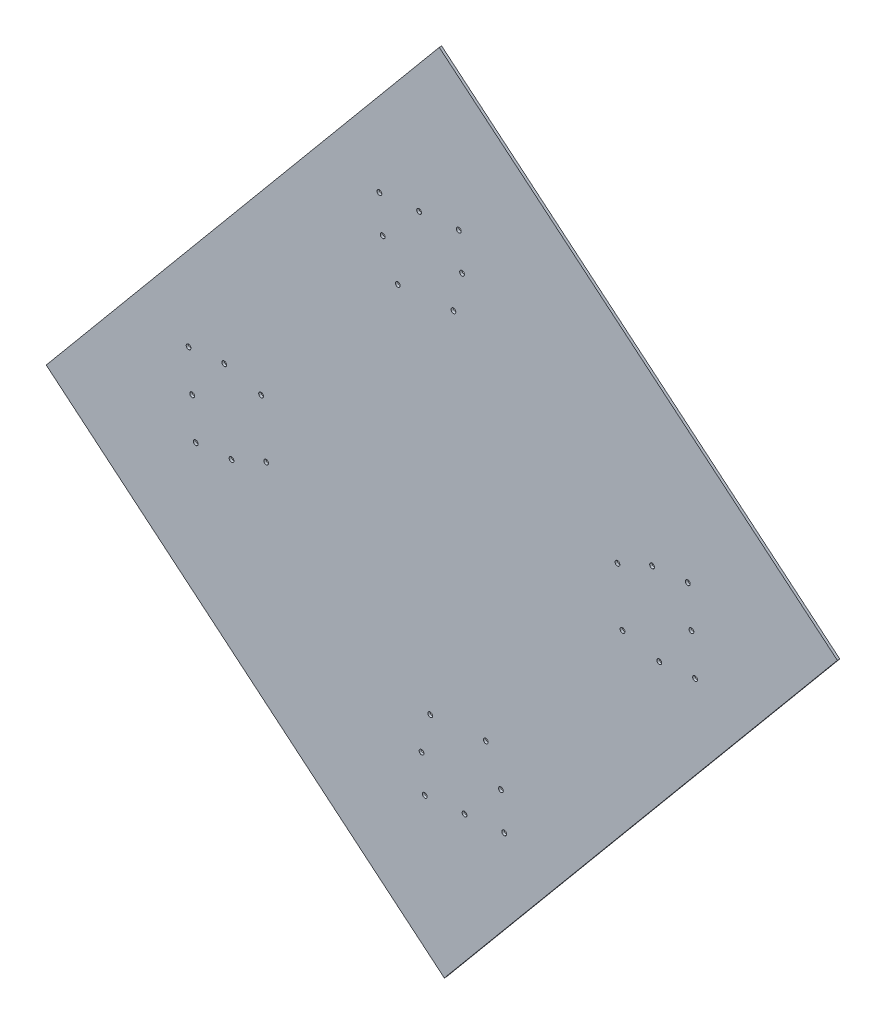
ISO-10303-21;
HEADER;
FILE_DESCRIPTION(('STEP AP214'),'2;1');
FILE_NAME('part.step','',(''),(''),'','','');
FILE_SCHEMA(('AUTOMOTIVE_DESIGN { 1 0 10303 214 1 1 1 1 }'));
ENDSEC;
DATA;
#1=APPLICATION_CONTEXT('core data for automotive mechanical design processes');
#2=APPLICATION_PROTOCOL_DEFINITION('international standard','automotive_design',2000,#1);
#3=PRODUCT_CONTEXT('',#1,'mechanical');
#4=PRODUCT('Part','Part','',(#3));
#5=PRODUCT_RELATED_PRODUCT_CATEGORY('part','',(#4));
#6=PRODUCT_DEFINITION_FORMATION('','',#4);
#7=PRODUCT_DEFINITION_CONTEXT('part definition',#1,'design');
#8=PRODUCT_DEFINITION('design','',#6,#7);
#9=PRODUCT_DEFINITION_SHAPE('','',#8);
#10=(LENGTH_UNIT() NAMED_UNIT(*) SI_UNIT(.MILLI.,.METRE.));
#11=(NAMED_UNIT(*) PLANE_ANGLE_UNIT() SI_UNIT($,.RADIAN.));
#12=(NAMED_UNIT(*) SI_UNIT($,.STERADIAN.) SOLID_ANGLE_UNIT());
#13=UNCERTAINTY_MEASURE_WITH_UNIT(LENGTH_MEASURE(1.E-05),#10,'distance_accuracy_value','');
#14=(GEOMETRIC_REPRESENTATION_CONTEXT(3) GLOBAL_UNCERTAINTY_ASSIGNED_CONTEXT((#13)) GLOBAL_UNIT_ASSIGNED_CONTEXT((#10,
#11,#12)) REPRESENTATION_CONTEXT('',''));
#15=CARTESIAN_POINT('',(0.,0.,0.));
#16=DIRECTION('',(0.,0.,1.));
#17=DIRECTION('',(1.,0.,0.));
#18=AXIS2_PLACEMENT_3D('',#15,#16,#17);
#19=CARTESIAN_POINT('',(0.,0.,3.));
#20=DIRECTION('',(0.,0.,1.));
#21=DIRECTION('',(1.,0.,0.));
#22=AXIS2_PLACEMENT_3D('',#19,#20,#21);
#23=PLANE('',#22);
#24=CARTESIAN_POINT('',(1000.31822953271,-1996.08546899373,3.));
#25=DIRECTION('',(0.,0.,1.));
#26=DIRECTION('',(1.,0.,0.));
#27=AXIS2_PLACEMENT_3D('',#24,#25,#26);
#28=CIRCLE('',#27,3.00000000000015);
#29=CARTESIAN_POINT('',(1003.31822953271,-1996.08546899373,3.));
#30=VERTEX_POINT('',#29);
#31=EDGE_CURVE('E265',#30,#30,#28,.T.);
#32=ORIENTED_EDGE('',*,*,#31,.F.);
#33=EDGE_LOOP('',(#32));
#34=FACE_BOUND('',#33,.T.);
#35=CARTESIAN_POINT('',(993.526055939657,-2087.07374504006,3.));
#36=DIRECTION('',(0.,0.,1.));
#37=DIRECTION('',(1.,0.,0.));
#38=AXIS2_PLACEMENT_3D('',#35,#36,#37);
#39=CIRCLE('',#38,2.99999999999988);
#40=CARTESIAN_POINT('',(996.526055939657,-2087.07374504006,3.));
#41=VERTEX_POINT('',#40);
#42=EDGE_CURVE('E253',#41,#41,#39,.T.);
#43=ORIENTED_EDGE('',*,*,#42,.F.);
#44=EDGE_LOOP('',(#43));
#45=FACE_BOUND('',#44,.T.);
#46=CARTESIAN_POINT('',(1093.11557483534,-2078.02235143862,3.));
#47=DIRECTION('',(0.,0.,1.));
#48=DIRECTION('',(1.,0.,0.));
#49=AXIS2_PLACEMENT_3D('',#46,#47,#48);
#50=CIRCLE('',#49,3.00000000000043);
#51=CARTESIAN_POINT('',(1096.11557483534,-2078.02235143862,3.));
#52=VERTEX_POINT('',#51);
#53=EDGE_CURVE('E241',#52,#52,#50,.T.);
#54=ORIENTED_EDGE('',*,*,#53,.F.);
#55=EDGE_LOOP('',(#54));
#56=FACE_BOUND('',#55,.T.);
#57=CARTESIAN_POINT('',(959.695575049455,-1549.12770818995,3.));
#58=DIRECTION('',(0.,0.,1.));
#59=DIRECTION('',(1.,0.,0.));
#60=AXIS2_PLACEMENT_3D('',#57,#58,#59);
#61=CIRCLE('',#60,3.00000000000015);
#62=CARTESIAN_POINT('',(962.695575049456,-1549.12770818995,3.));
#63=VERTEX_POINT('',#62);
#64=EDGE_CURVE('E229',#63,#63,#61,.T.);
#65=ORIENTED_EDGE('',*,*,#64,.F.);
#66=EDGE_LOOP('',(#65));
#67=FACE_BOUND('',#66,.T.);
#68=CARTESIAN_POINT('',(1040.27353899013,-1496.61874012567,3.));
#69=DIRECTION('',(0.,0.,1.));
#70=DIRECTION('',(1.,0.,0.));
#71=AXIS2_PLACEMENT_3D('',#68,#69,#70);
#72=CIRCLE('',#71,3.00000000000015);
#73=CARTESIAN_POINT('',(1043.27353899013,-1496.61874012567,3.));
#74=VERTEX_POINT('',#73);
#75=EDGE_CURVE('E217',#74,#74,#72,.T.);
#76=ORIENTED_EDGE('',*,*,#75,.F.);
#77=EDGE_LOOP('',(#76));
#78=FACE_BOUND('',#77,.T.);
#79=CARTESIAN_POINT('',(986.405652421644,-1456.32915342334,3.));
#80=DIRECTION('',(0.,0.,1.));
#81=DIRECTION('',(1.,0.,0.));
#82=AXIS2_PLACEMENT_3D('',#79,#80,#81);
#83=CIRCLE('',#82,3.00000000000015);
#84=CARTESIAN_POINT('',(989.405652421645,-1456.32915342334,3.));
#85=VERTEX_POINT('',#84);
#86=EDGE_CURVE('E205',#85,#85,#83,.T.);
#87=ORIENTED_EDGE('',*,*,#86,.F.);
#88=EDGE_LOOP('',(#87));
#89=FACE_BOUND('',#88,.T.);
#90=CARTESIAN_POINT('',(940.684020094458,-1505.67013372711,3.));
#91=DIRECTION('',(0.,0.,1.));
#92=DIRECTION('',(1.,0.,0.));
#93=AXIS2_PLACEMENT_3D('',#90,#91,#92);
#94=CIRCLE('',#93,2.99999999999994);
#95=CARTESIAN_POINT('',(943.684020094458,-1505.67013372711,3.));
#96=VERTEX_POINT('',#95);
#97=EDGE_CURVE('E193',#96,#96,#94,.T.);
#98=ORIENTED_EDGE('',*,*,#97,.F.);
#99=EDGE_LOOP('',(#98));
#100=FACE_BOUND('',#99,.T.);
#101=CARTESIAN_POINT('',(1332.49837811329,-1790.77577879625,3.));
#102=DIRECTION('',(0.,0.,1.));
#103=DIRECTION('',(1.,0.,0.));
#104=AXIS2_PLACEMENT_3D('',#101,#102,#103);
#105=CIRCLE('',#104,3.00000000000015);
#106=CARTESIAN_POINT('',(1335.49837811329,-1790.77577879625,3.));
#107=VERTEX_POINT('',#106);
#108=EDGE_CURVE('E181',#107,#107,#105,.T.);
#109=ORIENTED_EDGE('',*,*,#108,.F.);
#110=EDGE_LOOP('',(#109));
#111=FACE_BOUND('',#110,.T.);
#112=CARTESIAN_POINT('',(706.279483297293,-1847.69094176211,3.));
#113=DIRECTION('',(0.,0.,1.));
#114=DIRECTION('',(1.,0.,0.));
#115=AXIS2_PLACEMENT_3D('',#112,#113,#114);
#116=CIRCLE('',#115,3.00000000000005);
#117=CARTESIAN_POINT('',(709.279483297293,-1847.69094176211,3.));
#118=VERTEX_POINT('',#117);
#119=EDGE_CURVE('E169',#118,#118,#116,.T.);
#120=ORIENTED_EDGE('',*,*,#119,.F.);
#121=EDGE_LOOP('',(#120));
#122=FACE_BOUND('',#121,.T.);
#123=CARTESIAN_POINT('',(751.094766800343,-1843.61781464145,3.));
#124=DIRECTION('',(0.,0.,1.));
#125=DIRECTION('',(1.,0.,0.));
#126=AXIS2_PLACEMENT_3D('',#123,#124,#125);
#127=CIRCLE('',#126,3.00000000000043);
#128=CARTESIAN_POINT('',(754.094766800343,-1843.61781464145,3.));
#129=VERTEX_POINT('',#128);
#130=EDGE_CURVE('E157',#129,#129,#127,.T.);
#131=ORIENTED_EDGE('',*,*,#130,.F.);
#132=EDGE_LOOP('',(#131));
#133=FACE_BOUND('',#132,.T.);
#134=CARTESIAN_POINT('',(788.216365742172,-1754.89359645949,3.));
#135=DIRECTION('',(0.,0.,1.));
#136=DIRECTION('',(1.,0.,0.));
#137=AXIS2_PLACEMENT_3D('',#134,#135,#136);
#138=CIRCLE('',#137,3.00000000000015);
#139=CARTESIAN_POINT('',(791.216365742172,-1754.89359645949,3.));
#140=VERTEX_POINT('',#139);
#141=EDGE_CURVE('E145',#140,#140,#138,.T.);
#142=ORIENTED_EDGE('',*,*,#141,.F.);
#143=EDGE_LOOP('',(#142));
#144=FACE_BOUND('',#143,.T.);
#145=CARTESIAN_POINT('',(1323.44698451184,-1691.18625990057,3.));
#146=DIRECTION('',(0.,0.,1.));
#147=DIRECTION('',(1.,0.,0.));
#148=AXIS2_PLACEMENT_3D('',#145,#146,#147);
#149=CIRCLE('',#148,3.00000000000037);
#150=CARTESIAN_POINT('',(1326.44698451184,-1691.18625990057,3.));
#151=VERTEX_POINT('',#150);
#152=EDGE_CURVE('E133',#151,#151,#149,.T.);
#153=ORIENTED_EDGE('',*,*,#152,.F.);
#154=EDGE_LOOP('',(#153));
#155=FACE_BOUND('',#154,.T.);
#156=CARTESIAN_POINT('',(1235.17412654596,-1714.27094197622,3.));
#157=DIRECTION('',(0.,0.,1.));
#158=DIRECTION('',(1.,0.,0.));
#159=AXIS2_PLACEMENT_3D('',#156,#157,#158);
#160=CIRCLE('',#159,2.99999999999994);
#161=CARTESIAN_POINT('',(1238.17412654596,-1714.27094197622,3.));
#162=VERTEX_POINT('',#161);
#163=EDGE_CURVE('E121',#162,#162,#160,.T.);
#164=ORIENTED_EDGE('',*,*,#163,.F.);
#165=EDGE_LOOP('',(#164));
#166=FACE_BOUND('',#165,.T.);
#167=CARTESIAN_POINT('',(701.75378649657,-1797.89618231427,3.));
#168=DIRECTION('',(0.,0.,1.));
#169=DIRECTION('',(1.,0.,0.));
#170=AXIS2_PLACEMENT_3D('',#167,#168,#169);
#171=CIRCLE('',#170,2.99999999999994);
#172=CARTESIAN_POINT('',(704.75378649657,-1797.89618231427,3.));
#173=VERTEX_POINT('',#172);
#174=EDGE_CURVE('E100',#173,#173,#171,.T.);
#175=ORIENTED_EDGE('',*,*,#174,.F.);
#176=EDGE_LOOP('',(#175));
#177=FACE_BOUND('',#176,.T.);
#178=DIRECTION('',(0.768207259410039,-0.640201223514699,0.));
#179=VECTOR('',#178,1.);
#180=CARTESIAN_POINT('',(518.718403543146,-1857.13299806192,3.));
#181=LINE('',#180,#179);
#182=CARTESIAN_POINT('',(518.718403543146,-1857.13299806192,3.));
#183=VERTEX_POINT('',#182);
#184=CARTESIAN_POINT('',(1018.05312215967,-2273.26379334647,3.));
#185=VERTEX_POINT('',#184);
#186=EDGE_CURVE('E85',#183,#185,#181,.T.);
#187=ORIENTED_EDGE('',*,*,#186,.T.);
#188=DIRECTION('',(0.640201223514699,0.768207259410039,0.));
#189=VECTOR('',#188,1.);
#190=CARTESIAN_POINT('',(1018.05312215967,-2273.26379334647,3.));
#191=LINE('',#190,#189);
#192=CARTESIAN_POINT('',(1511.00806426599,-1681.74420360074,3.));
#193=VERTEX_POINT('',#192);
#194=EDGE_CURVE('E80',#185,#193,#191,.T.);
#195=ORIENTED_EDGE('',*,*,#194,.T.);
#196=DIRECTION('',(-0.768207259410039,0.640201223514699,0.));
#197=VECTOR('',#196,1.);
#198=CARTESIAN_POINT('',(1511.00806426599,-1681.74420360074,3.));
#199=LINE('',#198,#197);
#200=CARTESIAN_POINT('',(1011.67334564946,-1265.61340831619,3.));
#201=VERTEX_POINT('',#200);
#202=EDGE_CURVE('E83',#193,#201,#199,.T.);
#203=ORIENTED_EDGE('',*,*,#202,.T.);
#204=DIRECTION('',(-0.640201223514699,-0.768207259410039,0.));
#205=VECTOR('',#204,1.);
#206=CARTESIAN_POINT('',(1011.67334564946,-1265.61340831619,3.));
#207=LINE('',#206,#205);
#208=EDGE_CURVE('E50',#201,#183,#207,.T.);
#209=ORIENTED_EDGE('',*,*,#208,.T.);
#210=EDGE_LOOP('',(#187,#195,#203,#209));
#211=FACE_BOUND('',#210,.T.);
#212=CARTESIAN_POINT('',(1327.97268131257,-1740.98101934841,3.));
#213=DIRECTION('',(0.,0.,1.));
#214=DIRECTION('',(1.,0.,0.));
#215=AXIS2_PLACEMENT_3D('',#212,#213,#214);
#216=CIRCLE('',#215,3.00000000000037);
#217=CARTESIAN_POINT('',(1330.97268131257,-1740.98101934841,3.));
#218=VERTEX_POINT('',#217);
#219=EDGE_CURVE('E115',#218,#218,#216,.T.);
#220=ORIENTED_EDGE('',*,*,#219,.F.);
#221=EDGE_LOOP('',(#220));
#222=FACE_BOUND('',#221,.T.);
#223=CARTESIAN_POINT('',(1278.63170100879,-1695.25938702122,3.));
#224=DIRECTION('',(0.,0.,1.));
#225=DIRECTION('',(1.,0.,0.));
#226=AXIS2_PLACEMENT_3D('',#223,#224,#225);
#227=CIRCLE('',#226,3.00000000000015);
#228=CARTESIAN_POINT('',(1281.63170100879,-1695.25938702122,3.));
#229=VERTEX_POINT('',#228);
#230=EDGE_CURVE('E127',#229,#229,#227,.T.);
#231=ORIENTED_EDGE('',*,*,#230,.F.);
#232=EDGE_LOOP('',(#231));
#233=FACE_BOUND('',#232,.T.);
#234=CARTESIAN_POINT('',(697.228089695848,-1748.10142286643,3.));
#235=DIRECTION('',(0.,0.,1.));
#236=DIRECTION('',(1.,0.,0.));
#237=AXIS2_PLACEMENT_3D('',#234,#235,#236);
#238=CIRCLE('',#237,3.00000000000015);
#239=CARTESIAN_POINT('',(700.228089695848,-1748.10142286643,3.));
#240=VERTEX_POINT('',#239);
#241=EDGE_CURVE('E139',#240,#240,#238,.T.);
#242=ORIENTED_EDGE('',*,*,#241,.F.);
#243=EDGE_LOOP('',(#242));
#244=FACE_BOUND('',#243,.T.);
#245=CARTESIAN_POINT('',(742.043373198905,-1744.02829574578,3.));
#246=DIRECTION('',(0.,0.,1.));
#247=DIRECTION('',(1.,0.,0.));
#248=AXIS2_PLACEMENT_3D('',#245,#246,#247);
#249=CIRCLE('',#248,3.00000000000015);
#250=CARTESIAN_POINT('',(745.043373198905,-1744.02829574578,3.));
#251=VERTEX_POINT('',#250);
#252=EDGE_CURVE('E151',#251,#251,#249,.T.);
#253=ORIENTED_EDGE('',*,*,#252,.F.);
#254=EDGE_LOOP('',(#253));
#255=FACE_BOUND('',#254,.T.);
#256=CARTESIAN_POINT('',(794.552341263182,-1824.60625968646,3.));
#257=DIRECTION('',(0.,0.,1.));
#258=DIRECTION('',(1.,0.,0.));
#259=AXIS2_PLACEMENT_3D('',#256,#257,#258);
#260=CIRCLE('',#259,3.00000000000005);
#261=CARTESIAN_POINT('',(797.552341263182,-1824.60625968646,3.));
#262=VERTEX_POINT('',#261);
#263=EDGE_CURVE('E163',#262,#262,#260,.T.);
#264=ORIENTED_EDGE('',*,*,#263,.F.);
#265=EDGE_LOOP('',(#264));
#266=FACE_BOUND('',#265,.T.);
#267=CARTESIAN_POINT('',(1241.51010206696,-1783.98360520319,3.));
#268=DIRECTION('',(0.,0.,1.));
#269=DIRECTION('',(1.,0.,0.));
#270=AXIS2_PLACEMENT_3D('',#267,#268,#269);
#271=CIRCLE('',#270,2.99999999999994);
#272=CARTESIAN_POINT('',(1244.51010206696,-1783.98360520319,3.));
#273=VERTEX_POINT('',#272);
#274=EDGE_CURVE('E175',#273,#273,#271,.T.);
#275=ORIENTED_EDGE('',*,*,#274,.F.);
#276=EDGE_LOOP('',(#275));
#277=FACE_BOUND('',#276,.T.);
#278=CARTESIAN_POINT('',(1287.68309461023,-1794.84890591689,3.));
#279=DIRECTION('',(0.,0.,1.));
#280=DIRECTION('',(1.,0.,0.));
#281=AXIS2_PLACEMENT_3D('',#278,#279,#280);
#282=CIRCLE('',#281,2.99999999999994);
#283=CARTESIAN_POINT('',(1290.68309461023,-1794.84890591689,3.));
#284=VERTEX_POINT('',#283);
#285=EDGE_CURVE('E187',#284,#284,#282,.T.);
#286=ORIENTED_EDGE('',*,*,#285,.F.);
#287=EDGE_LOOP('',(#286));
#288=FACE_BOUND('',#287,.T.);
#289=CARTESIAN_POINT('',(936.610892973806,-1460.85485022405,3.));
#290=DIRECTION('',(0.,0.,1.));
#291=DIRECTION('',(1.,0.,0.));
#292=AXIS2_PLACEMENT_3D('',#289,#290,#291);
#293=CIRCLE('',#292,2.99999999999984);
#294=CARTESIAN_POINT('',(939.610892973805,-1460.85485022405,3.));
#295=VERTEX_POINT('',#294);
#296=EDGE_CURVE('E199',#295,#295,#293,.T.);
#297=ORIENTED_EDGE('',*,*,#296,.F.);
#298=EDGE_LOOP('',(#297));
#299=FACE_BOUND('',#298,.T.);
#300=CARTESIAN_POINT('',(1036.20041186948,-1451.80345662262,3.));
#301=DIRECTION('',(0.,0.,1.));
#302=DIRECTION('',(1.,0.,0.));
#303=AXIS2_PLACEMENT_3D('',#300,#301,#302);
#304=CIRCLE('',#303,3.00000000000015);
#305=CARTESIAN_POINT('',(1039.20041186948,-1451.80345662262,3.));
#306=VERTEX_POINT('',#305);
#307=EDGE_CURVE('E211',#306,#306,#304,.T.);
#308=ORIENTED_EDGE('',*,*,#307,.F.);
#309=EDGE_LOOP('',(#308));
#310=FACE_BOUND('',#309,.T.);
#311=CARTESIAN_POINT('',(1029.40823827643,-1542.79173266894,3.));
#312=DIRECTION('',(0.,0.,1.));
#313=DIRECTION('',(1.,0.,0.));
#314=AXIS2_PLACEMENT_3D('',#311,#312,#313);
#315=CIRCLE('',#314,3.00000000000015);
#316=CARTESIAN_POINT('',(1032.40823827643,-1542.79173266894,3.));
#317=VERTEX_POINT('',#316);
#318=EDGE_CURVE('E223',#317,#317,#315,.T.);
#319=ORIENTED_EDGE('',*,*,#318,.F.);
#320=EDGE_LOOP('',(#319));
#321=FACE_BOUND('',#320,.T.);
#322=CARTESIAN_POINT('',(1089.04244771468,-2033.20706793556,3.));
#323=DIRECTION('',(0.,0.,1.));
#324=DIRECTION('',(1.,0.,0.));
#325=AXIS2_PLACEMENT_3D('',#322,#323,#324);
#326=CIRCLE('',#325,3.00000000000022);
#327=CARTESIAN_POINT('',(1092.04244771468,-2033.20706793556,3.));
#328=VERTEX_POINT('',#327);
#329=EDGE_CURVE('E235',#328,#328,#326,.T.);
#330=ORIENTED_EDGE('',*,*,#329,.F.);
#331=EDGE_LOOP('',(#330));
#332=FACE_BOUND('',#331,.T.);
#333=CARTESIAN_POINT('',(1043.3208153875,-2082.54804823934,3.));
#334=DIRECTION('',(0.,0.,1.));
#335=DIRECTION('',(1.,0.,0.));
#336=AXIS2_PLACEMENT_3D('',#333,#334,#335);
#337=CIRCLE('',#336,2.99999999999988);
#338=CARTESIAN_POINT('',(1046.3208153875,-2082.54804823934,3.));
#339=VERTEX_POINT('',#338);
#340=EDGE_CURVE('E247',#339,#339,#337,.T.);
#341=ORIENTED_EDGE('',*,*,#340,.F.);
#342=EDGE_LOOP('',(#341));
#343=FACE_BOUND('',#342,.T.);
#344=CARTESIAN_POINT('',(989.452928819013,-2042.258461537,3.));
#345=DIRECTION('',(0.,0.,1.));
#346=DIRECTION('',(1.,0.,0.));
#347=AXIS2_PLACEMENT_3D('',#344,#345,#346);
#348=CIRCLE('',#347,3.00000000000033);
#349=CARTESIAN_POINT('',(992.452928819013,-2042.258461537,3.));
#350=VERTEX_POINT('',#349);
#351=EDGE_CURVE('E259',#350,#350,#348,.T.);
#352=ORIENTED_EDGE('',*,*,#351,.F.);
#353=EDGE_LOOP('',(#352));
#354=FACE_BOUND('',#353,.T.);
#355=CARTESIAN_POINT('',(1070.03089275969,-1989.74949347273,3.));
#356=DIRECTION('',(0.,0.,1.));
#357=DIRECTION('',(1.,0.,0.));
#358=AXIS2_PLACEMENT_3D('',#355,#356,#357);
#359=CIRCLE('',#358,3.00000000000015);
#360=CARTESIAN_POINT('',(1073.03089275969,-1989.74949347273,3.));
#361=VERTEX_POINT('',#360);
#362=EDGE_CURVE('E271',#361,#361,#359,.T.);
#363=ORIENTED_EDGE('',*,*,#362,.F.);
#364=EDGE_LOOP('',(#363));
#365=FACE_BOUND('',#364,.T.);
#366=ADVANCED_FACE('F33',(#34,#45,#56,#67,#78,#89,#100,#111,#122,#133,#144,#155,#166,#177,#211,
#222,#233,#244,#255,#266,#277,#288,#299,#310,#321,#332,#343,#354,#365),#23,.T.);
#367=CARTESIAN_POINT('',(0.,0.,0.));
#368=DIRECTION('',(0.,0.,1.));
#369=DIRECTION('',(1.,0.,0.));
#370=AXIS2_PLACEMENT_3D('',#367,#368,#369);
#371=PLANE('',#370);
#372=DIRECTION('',(0.768207259410039,-0.640201223514699,0.));
#373=VECTOR('',#372,1.);
#374=CARTESIAN_POINT('',(518.718403543146,-1857.13299806192,0.));
#375=LINE('',#374,#373);
#376=CARTESIAN_POINT('',(518.718403543146,-1857.13299806192,0.));
#377=VERTEX_POINT('',#376);
#378=CARTESIAN_POINT('',(1018.05312215967,-2273.26379334647,0.));
#379=VERTEX_POINT('',#378);
#380=EDGE_CURVE('E97',#377,#379,#375,.T.);
#381=ORIENTED_EDGE('',*,*,#380,.F.);
#382=DIRECTION('',(-0.640201223514699,-0.768207259410039,0.));
#383=VECTOR('',#382,1.);
#384=CARTESIAN_POINT('',(1011.67334564946,-1265.61340831619,0.));
#385=LINE('',#384,#383);
#386=CARTESIAN_POINT('',(1011.67334564946,-1265.61340831619,0.));
#387=VERTEX_POINT('',#386);
#388=EDGE_CURVE('E73',#387,#377,#385,.T.);
#389=ORIENTED_EDGE('',*,*,#388,.F.);
#390=DIRECTION('',(-0.768207259410039,0.640201223514699,0.));
#391=VECTOR('',#390,1.);
#392=CARTESIAN_POINT('',(1511.00806426599,-1681.74420360074,0.));
#393=LINE('',#392,#391);
#394=CARTESIAN_POINT('',(1511.00806426599,-1681.74420360074,0.));
#395=VERTEX_POINT('',#394);
#396=EDGE_CURVE('E67',#395,#387,#393,.T.);
#397=ORIENTED_EDGE('',*,*,#396,.F.);
#398=DIRECTION('',(0.640201223514699,0.768207259410039,0.));
#399=VECTOR('',#398,1.);
#400=CARTESIAN_POINT('',(1018.05312215967,-2273.26379334647,0.));
#401=LINE('',#400,#399);
#402=EDGE_CURVE('E89',#379,#395,#401,.T.);
#403=ORIENTED_EDGE('',*,*,#402,.F.);
#404=EDGE_LOOP('',(#381,#389,#397,#403));
#405=FACE_BOUND('',#404,.T.);
#406=CARTESIAN_POINT('',(701.75378649657,-1797.89618231427,0.));
#407=DIRECTION('',(0.,0.,1.));
#408=DIRECTION('',(1.,0.,0.));
#409=AXIS2_PLACEMENT_3D('',#406,#407,#408);
#410=CIRCLE('',#409,2.99999999999994);
#411=CARTESIAN_POINT('',(704.75378649657,-1797.89618231427,0.));
#412=VERTEX_POINT('',#411);
#413=EDGE_CURVE('E112',#412,#412,#410,.T.);
#414=ORIENTED_EDGE('',*,*,#413,.T.);
#415=EDGE_LOOP('',(#414));
#416=FACE_BOUND('',#415,.T.);
#417=CARTESIAN_POINT('',(1327.97268131257,-1740.98101934841,0.));
#418=DIRECTION('',(0.,0.,1.));
#419=DIRECTION('',(1.,0.,0.));
#420=AXIS2_PLACEMENT_3D('',#417,#418,#419);
#421=CIRCLE('',#420,3.00000000000037);
#422=CARTESIAN_POINT('',(1330.97268131257,-1740.98101934841,0.));
#423=VERTEX_POINT('',#422);
#424=EDGE_CURVE('E118',#423,#423,#421,.T.);
#425=ORIENTED_EDGE('',*,*,#424,.T.);
#426=EDGE_LOOP('',(#425));
#427=FACE_BOUND('',#426,.T.);
#428=CARTESIAN_POINT('',(1235.17412654596,-1714.27094197622,0.));
#429=DIRECTION('',(0.,0.,1.));
#430=DIRECTION('',(1.,0.,0.));
#431=AXIS2_PLACEMENT_3D('',#428,#429,#430);
#432=CIRCLE('',#431,2.99999999999994);
#433=CARTESIAN_POINT('',(1238.17412654596,-1714.27094197622,0.));
#434=VERTEX_POINT('',#433);
#435=EDGE_CURVE('E124',#434,#434,#432,.T.);
#436=ORIENTED_EDGE('',*,*,#435,.T.);
#437=EDGE_LOOP('',(#436));
#438=FACE_BOUND('',#437,.T.);
#439=CARTESIAN_POINT('',(1278.63170100879,-1695.25938702122,0.));
#440=DIRECTION('',(0.,0.,1.));
#441=DIRECTION('',(1.,0.,0.));
#442=AXIS2_PLACEMENT_3D('',#439,#440,#441);
#443=CIRCLE('',#442,3.00000000000015);
#444=CARTESIAN_POINT('',(1281.63170100879,-1695.25938702122,0.));
#445=VERTEX_POINT('',#444);
#446=EDGE_CURVE('E130',#445,#445,#443,.T.);
#447=ORIENTED_EDGE('',*,*,#446,.T.);
#448=EDGE_LOOP('',(#447));
#449=FACE_BOUND('',#448,.T.);
#450=CARTESIAN_POINT('',(1323.44698451184,-1691.18625990057,0.));
#451=DIRECTION('',(0.,0.,1.));
#452=DIRECTION('',(1.,0.,0.));
#453=AXIS2_PLACEMENT_3D('',#450,#451,#452);
#454=CIRCLE('',#453,3.00000000000037);
#455=CARTESIAN_POINT('',(1326.44698451184,-1691.18625990057,0.));
#456=VERTEX_POINT('',#455);
#457=EDGE_CURVE('E136',#456,#456,#454,.T.);
#458=ORIENTED_EDGE('',*,*,#457,.T.);
#459=EDGE_LOOP('',(#458));
#460=FACE_BOUND('',#459,.T.);
#461=CARTESIAN_POINT('',(697.228089695848,-1748.10142286643,0.));
#462=DIRECTION('',(0.,0.,1.));
#463=DIRECTION('',(1.,0.,0.));
#464=AXIS2_PLACEMENT_3D('',#461,#462,#463);
#465=CIRCLE('',#464,3.00000000000015);
#466=CARTESIAN_POINT('',(700.228089695848,-1748.10142286643,0.));
#467=VERTEX_POINT('',#466);
#468=EDGE_CURVE('E142',#467,#467,#465,.T.);
#469=ORIENTED_EDGE('',*,*,#468,.T.);
#470=EDGE_LOOP('',(#469));
#471=FACE_BOUND('',#470,.T.);
#472=CARTESIAN_POINT('',(788.216365742172,-1754.89359645949,0.));
#473=DIRECTION('',(0.,0.,1.));
#474=DIRECTION('',(1.,0.,0.));
#475=AXIS2_PLACEMENT_3D('',#472,#473,#474);
#476=CIRCLE('',#475,3.00000000000015);
#477=CARTESIAN_POINT('',(791.216365742172,-1754.89359645949,0.));
#478=VERTEX_POINT('',#477);
#479=EDGE_CURVE('E148',#478,#478,#476,.T.);
#480=ORIENTED_EDGE('',*,*,#479,.T.);
#481=EDGE_LOOP('',(#480));
#482=FACE_BOUND('',#481,.T.);
#483=CARTESIAN_POINT('',(742.043373198905,-1744.02829574578,0.));
#484=DIRECTION('',(0.,0.,1.));
#485=DIRECTION('',(1.,0.,0.));
#486=AXIS2_PLACEMENT_3D('',#483,#484,#485);
#487=CIRCLE('',#486,3.00000000000015);
#488=CARTESIAN_POINT('',(745.043373198905,-1744.02829574578,0.));
#489=VERTEX_POINT('',#488);
#490=EDGE_CURVE('E154',#489,#489,#487,.T.);
#491=ORIENTED_EDGE('',*,*,#490,.T.);
#492=EDGE_LOOP('',(#491));
#493=FACE_BOUND('',#492,.T.);
#494=CARTESIAN_POINT('',(751.094766800343,-1843.61781464145,0.));
#495=DIRECTION('',(0.,0.,1.));
#496=DIRECTION('',(1.,0.,0.));
#497=AXIS2_PLACEMENT_3D('',#494,#495,#496);
#498=CIRCLE('',#497,3.00000000000043);
#499=CARTESIAN_POINT('',(754.094766800343,-1843.61781464145,0.));
#500=VERTEX_POINT('',#499);
#501=EDGE_CURVE('E160',#500,#500,#498,.T.);
#502=ORIENTED_EDGE('',*,*,#501,.T.);
#503=EDGE_LOOP('',(#502));
#504=FACE_BOUND('',#503,.T.);
#505=CARTESIAN_POINT('',(794.552341263182,-1824.60625968646,0.));
#506=DIRECTION('',(0.,0.,1.));
#507=DIRECTION('',(1.,0.,0.));
#508=AXIS2_PLACEMENT_3D('',#505,#506,#507);
#509=CIRCLE('',#508,3.00000000000005);
#510=CARTESIAN_POINT('',(797.552341263182,-1824.60625968646,0.));
#511=VERTEX_POINT('',#510);
#512=EDGE_CURVE('E166',#511,#511,#509,.T.);
#513=ORIENTED_EDGE('',*,*,#512,.T.);
#514=EDGE_LOOP('',(#513));
#515=FACE_BOUND('',#514,.T.);
#516=CARTESIAN_POINT('',(706.279483297293,-1847.69094176211,0.));
#517=DIRECTION('',(0.,0.,1.));
#518=DIRECTION('',(1.,0.,0.));
#519=AXIS2_PLACEMENT_3D('',#516,#517,#518);
#520=CIRCLE('',#519,3.00000000000005);
#521=CARTESIAN_POINT('',(709.279483297293,-1847.69094176211,0.));
#522=VERTEX_POINT('',#521);
#523=EDGE_CURVE('E172',#522,#522,#520,.T.);
#524=ORIENTED_EDGE('',*,*,#523,.T.);
#525=EDGE_LOOP('',(#524));
#526=FACE_BOUND('',#525,.T.);
#527=CARTESIAN_POINT('',(1241.51010206696,-1783.98360520319,0.));
#528=DIRECTION('',(0.,0.,1.));
#529=DIRECTION('',(1.,0.,0.));
#530=AXIS2_PLACEMENT_3D('',#527,#528,#529);
#531=CIRCLE('',#530,2.99999999999994);
#532=CARTESIAN_POINT('',(1244.51010206696,-1783.98360520319,0.));
#533=VERTEX_POINT('',#532);
#534=EDGE_CURVE('E178',#533,#533,#531,.T.);
#535=ORIENTED_EDGE('',*,*,#534,.T.);
#536=EDGE_LOOP('',(#535));
#537=FACE_BOUND('',#536,.T.);
#538=CARTESIAN_POINT('',(1332.49837811329,-1790.77577879625,0.));
#539=DIRECTION('',(0.,0.,1.));
#540=DIRECTION('',(1.,0.,0.));
#541=AXIS2_PLACEMENT_3D('',#538,#539,#540);
#542=CIRCLE('',#541,3.00000000000015);
#543=CARTESIAN_POINT('',(1335.49837811329,-1790.77577879625,0.));
#544=VERTEX_POINT('',#543);
#545=EDGE_CURVE('E184',#544,#544,#542,.T.);
#546=ORIENTED_EDGE('',*,*,#545,.T.);
#547=EDGE_LOOP('',(#546));
#548=FACE_BOUND('',#547,.T.);
#549=CARTESIAN_POINT('',(1287.68309461023,-1794.84890591689,0.));
#550=DIRECTION('',(0.,0.,1.));
#551=DIRECTION('',(1.,0.,0.));
#552=AXIS2_PLACEMENT_3D('',#549,#550,#551);
#553=CIRCLE('',#552,2.99999999999994);
#554=CARTESIAN_POINT('',(1290.68309461023,-1794.84890591689,0.));
#555=VERTEX_POINT('',#554);
#556=EDGE_CURVE('E190',#555,#555,#553,.T.);
#557=ORIENTED_EDGE('',*,*,#556,.T.);
#558=EDGE_LOOP('',(#557));
#559=FACE_BOUND('',#558,.T.);
#560=CARTESIAN_POINT('',(940.684020094458,-1505.67013372711,0.));
#561=DIRECTION('',(0.,0.,1.));
#562=DIRECTION('',(1.,0.,0.));
#563=AXIS2_PLACEMENT_3D('',#560,#561,#562);
#564=CIRCLE('',#563,2.99999999999994);
#565=CARTESIAN_POINT('',(943.684020094458,-1505.67013372711,0.));
#566=VERTEX_POINT('',#565);
#567=EDGE_CURVE('E196',#566,#566,#564,.T.);
#568=ORIENTED_EDGE('',*,*,#567,.T.);
#569=EDGE_LOOP('',(#568));
#570=FACE_BOUND('',#569,.T.);
#571=CARTESIAN_POINT('',(936.610892973806,-1460.85485022405,0.));
#572=DIRECTION('',(0.,0.,1.));
#573=DIRECTION('',(1.,0.,0.));
#574=AXIS2_PLACEMENT_3D('',#571,#572,#573);
#575=CIRCLE('',#574,2.99999999999984);
#576=CARTESIAN_POINT('',(939.610892973805,-1460.85485022405,0.));
#577=VERTEX_POINT('',#576);
#578=EDGE_CURVE('E202',#577,#577,#575,.T.);
#579=ORIENTED_EDGE('',*,*,#578,.T.);
#580=EDGE_LOOP('',(#579));
#581=FACE_BOUND('',#580,.T.);
#582=CARTESIAN_POINT('',(986.405652421644,-1456.32915342334,0.));
#583=DIRECTION('',(0.,0.,1.));
#584=DIRECTION('',(1.,0.,0.));
#585=AXIS2_PLACEMENT_3D('',#582,#583,#584);
#586=CIRCLE('',#585,3.00000000000015);
#587=CARTESIAN_POINT('',(989.405652421645,-1456.32915342334,0.));
#588=VERTEX_POINT('',#587);
#589=EDGE_CURVE('E208',#588,#588,#586,.T.);
#590=ORIENTED_EDGE('',*,*,#589,.T.);
#591=EDGE_LOOP('',(#590));
#592=FACE_BOUND('',#591,.T.);
#593=CARTESIAN_POINT('',(1036.20041186948,-1451.80345662262,0.));
#594=DIRECTION('',(0.,0.,1.));
#595=DIRECTION('',(1.,0.,0.));
#596=AXIS2_PLACEMENT_3D('',#593,#594,#595);
#597=CIRCLE('',#596,3.00000000000015);
#598=CARTESIAN_POINT('',(1039.20041186948,-1451.80345662262,0.));
#599=VERTEX_POINT('',#598);
#600=EDGE_CURVE('E214',#599,#599,#597,.T.);
#601=ORIENTED_EDGE('',*,*,#600,.T.);
#602=EDGE_LOOP('',(#601));
#603=FACE_BOUND('',#602,.T.);
#604=CARTESIAN_POINT('',(1040.27353899013,-1496.61874012567,0.));
#605=DIRECTION('',(0.,0.,1.));
#606=DIRECTION('',(1.,0.,0.));
#607=AXIS2_PLACEMENT_3D('',#604,#605,#606);
#608=CIRCLE('',#607,3.00000000000015);
#609=CARTESIAN_POINT('',(1043.27353899013,-1496.61874012567,0.));
#610=VERTEX_POINT('',#609);
#611=EDGE_CURVE('E220',#610,#610,#608,.T.);
#612=ORIENTED_EDGE('',*,*,#611,.T.);
#613=EDGE_LOOP('',(#612));
#614=FACE_BOUND('',#613,.T.);
#615=CARTESIAN_POINT('',(1029.40823827643,-1542.79173266894,0.));
#616=DIRECTION('',(0.,0.,1.));
#617=DIRECTION('',(1.,0.,0.));
#618=AXIS2_PLACEMENT_3D('',#615,#616,#617);
#619=CIRCLE('',#618,3.00000000000015);
#620=CARTESIAN_POINT('',(1032.40823827643,-1542.79173266894,0.));
#621=VERTEX_POINT('',#620);
#622=EDGE_CURVE('E226',#621,#621,#619,.T.);
#623=ORIENTED_EDGE('',*,*,#622,.T.);
#624=EDGE_LOOP('',(#623));
#625=FACE_BOUND('',#624,.T.);
#626=CARTESIAN_POINT('',(959.695575049455,-1549.12770818995,0.));
#627=DIRECTION('',(0.,0.,1.));
#628=DIRECTION('',(1.,0.,0.));
#629=AXIS2_PLACEMENT_3D('',#626,#627,#628);
#630=CIRCLE('',#629,3.00000000000015);
#631=CARTESIAN_POINT('',(962.695575049456,-1549.12770818995,0.));
#632=VERTEX_POINT('',#631);
#633=EDGE_CURVE('E232',#632,#632,#630,.T.);
#634=ORIENTED_EDGE('',*,*,#633,.T.);
#635=EDGE_LOOP('',(#634));
#636=FACE_BOUND('',#635,.T.);
#637=CARTESIAN_POINT('',(1089.04244771468,-2033.20706793556,0.));
#638=DIRECTION('',(0.,0.,1.));
#639=DIRECTION('',(1.,0.,0.));
#640=AXIS2_PLACEMENT_3D('',#637,#638,#639);
#641=CIRCLE('',#640,3.00000000000022);
#642=CARTESIAN_POINT('',(1092.04244771468,-2033.20706793556,0.));
#643=VERTEX_POINT('',#642);
#644=EDGE_CURVE('E238',#643,#643,#641,.T.);
#645=ORIENTED_EDGE('',*,*,#644,.T.);
#646=EDGE_LOOP('',(#645));
#647=FACE_BOUND('',#646,.T.);
#648=CARTESIAN_POINT('',(1093.11557483534,-2078.02235143862,0.));
#649=DIRECTION('',(0.,0.,1.));
#650=DIRECTION('',(1.,0.,0.));
#651=AXIS2_PLACEMENT_3D('',#648,#649,#650);
#652=CIRCLE('',#651,3.00000000000043);
#653=CARTESIAN_POINT('',(1096.11557483534,-2078.02235143862,0.));
#654=VERTEX_POINT('',#653);
#655=EDGE_CURVE('E244',#654,#654,#652,.T.);
#656=ORIENTED_EDGE('',*,*,#655,.T.);
#657=EDGE_LOOP('',(#656));
#658=FACE_BOUND('',#657,.T.);
#659=CARTESIAN_POINT('',(1043.3208153875,-2082.54804823934,0.));
#660=DIRECTION('',(0.,0.,1.));
#661=DIRECTION('',(1.,0.,0.));
#662=AXIS2_PLACEMENT_3D('',#659,#660,#661);
#663=CIRCLE('',#662,2.99999999999988);
#664=CARTESIAN_POINT('',(1046.3208153875,-2082.54804823934,0.));
#665=VERTEX_POINT('',#664);
#666=EDGE_CURVE('E250',#665,#665,#663,.T.);
#667=ORIENTED_EDGE('',*,*,#666,.T.);
#668=EDGE_LOOP('',(#667));
#669=FACE_BOUND('',#668,.T.);
#670=CARTESIAN_POINT('',(993.526055939657,-2087.07374504006,0.));
#671=DIRECTION('',(0.,0.,1.));
#672=DIRECTION('',(1.,0.,0.));
#673=AXIS2_PLACEMENT_3D('',#670,#671,#672);
#674=CIRCLE('',#673,2.99999999999988);
#675=CARTESIAN_POINT('',(996.526055939657,-2087.07374504006,0.));
#676=VERTEX_POINT('',#675);
#677=EDGE_CURVE('E256',#676,#676,#674,.T.);
#678=ORIENTED_EDGE('',*,*,#677,.T.);
#679=EDGE_LOOP('',(#678));
#680=FACE_BOUND('',#679,.T.);
#681=CARTESIAN_POINT('',(989.452928819013,-2042.258461537,0.));
#682=DIRECTION('',(0.,0.,1.));
#683=DIRECTION('',(1.,0.,0.));
#684=AXIS2_PLACEMENT_3D('',#681,#682,#683);
#685=CIRCLE('',#684,3.00000000000033);
#686=CARTESIAN_POINT('',(992.452928819013,-2042.258461537,0.));
#687=VERTEX_POINT('',#686);
#688=EDGE_CURVE('E262',#687,#687,#685,.T.);
#689=ORIENTED_EDGE('',*,*,#688,.T.);
#690=EDGE_LOOP('',(#689));
#691=FACE_BOUND('',#690,.T.);
#692=CARTESIAN_POINT('',(1000.31822953271,-1996.08546899373,0.));
#693=DIRECTION('',(0.,0.,1.));
#694=DIRECTION('',(1.,0.,0.));
#695=AXIS2_PLACEMENT_3D('',#692,#693,#694);
#696=CIRCLE('',#695,3.00000000000015);
#697=CARTESIAN_POINT('',(1003.31822953271,-1996.08546899373,0.));
#698=VERTEX_POINT('',#697);
#699=EDGE_CURVE('E268',#698,#698,#696,.T.);
#700=ORIENTED_EDGE('',*,*,#699,.T.);
#701=EDGE_LOOP('',(#700));
#702=FACE_BOUND('',#701,.T.);
#703=CARTESIAN_POINT('',(1070.03089275969,-1989.74949347273,0.));
#704=DIRECTION('',(0.,0.,1.));
#705=DIRECTION('',(1.,0.,0.));
#706=AXIS2_PLACEMENT_3D('',#703,#704,#705);
#707=CIRCLE('',#706,3.00000000000015);
#708=CARTESIAN_POINT('',(1073.03089275969,-1989.74949347273,0.));
#709=VERTEX_POINT('',#708);
#710=EDGE_CURVE('E274',#709,#709,#707,.T.);
#711=ORIENTED_EDGE('',*,*,#710,.T.);
#712=EDGE_LOOP('',(#711));
#713=FACE_BOUND('',#712,.T.);
#714=ADVANCED_FACE('F108',(#405,#416,#427,#438,#449,#460,#471,#482,#493,#504,#515,#526,#537,
#548,#559,#570,#581,#592,#603,#614,#625,#636,#647,#658,#669,#680,#691,#702,#713),#371,.F.);
#715=CARTESIAN_POINT('',(518.718403543146,-1857.13299806192,3.));
#716=DIRECTION('',(0.640201223514699,0.768207259410039,0.));
#717=DIRECTION('',(-0.768207259410039,0.640201223514699,0.));
#718=AXIS2_PLACEMENT_3D('',#715,#716,#717);
#719=PLANE('',#718);
#720=ORIENTED_EDGE('',*,*,#380,.T.);
#721=DIRECTION('',(0.,0.,-1.));
#722=VECTOR('',#721,1.);
#723=CARTESIAN_POINT('',(1018.05312215967,-2273.26379334647,3.));
#724=LINE('',#723,#722);
#725=EDGE_CURVE('E11',#185,#379,#724,.T.);
#726=ORIENTED_EDGE('',*,*,#725,.F.);
#727=ORIENTED_EDGE('',*,*,#186,.F.);
#728=DIRECTION('',(0.,0.,-1.));
#729=VECTOR('',#728,1.);
#730=CARTESIAN_POINT('',(518.718403543146,-1857.13299806192,3.));
#731=LINE('',#730,#729);
#732=EDGE_CURVE('E93',#183,#377,#731,.T.);
#733=ORIENTED_EDGE('',*,*,#732,.T.);
#734=EDGE_LOOP('',(#720,#726,#727,#733));
#735=FACE_BOUND('',#734,.T.);
#736=ADVANCED_FACE('F35',(#735),#719,.F.);
#737=CARTESIAN_POINT('',(1018.05312215967,-2273.26379334647,3.));
#738=DIRECTION('',(-0.768207259410039,0.640201223514699,0.));
#739=DIRECTION('',(-0.640201223514699,-0.768207259410039,0.));
#740=AXIS2_PLACEMENT_3D('',#737,#738,#739);
#741=PLANE('',#740);
#742=ORIENTED_EDGE('',*,*,#402,.T.);
#743=DIRECTION('',(0.,0.,-1.));
#744=VECTOR('',#743,1.);
#745=CARTESIAN_POINT('',(1511.00806426599,-1681.74420360074,3.));
#746=LINE('',#745,#744);
#747=EDGE_CURVE('E42',#193,#395,#746,.T.);
#748=ORIENTED_EDGE('',*,*,#747,.F.);
#749=ORIENTED_EDGE('',*,*,#194,.F.);
#750=ORIENTED_EDGE('',*,*,#725,.T.);
#751=EDGE_LOOP('',(#742,#748,#749,#750));
#752=FACE_BOUND('',#751,.T.);
#753=ADVANCED_FACE('F88',(#752),#741,.F.);
#754=CARTESIAN_POINT('',(1511.00806426599,-1681.74420360074,3.));
#755=DIRECTION('',(-0.640201223514699,-0.768207259410039,0.));
#756=DIRECTION('',(0.768207259410039,-0.640201223514699,0.));
#757=AXIS2_PLACEMENT_3D('',#754,#755,#756);
#758=PLANE('',#757);
#759=ORIENTED_EDGE('',*,*,#396,.T.);
#760=DIRECTION('',(0.,0.,-1.));
#761=VECTOR('',#760,1.);
#762=CARTESIAN_POINT('',(1011.67334564946,-1265.61340831619,3.));
#763=LINE('',#762,#761);
#764=EDGE_CURVE('E90',#201,#387,#763,.T.);
#765=ORIENTED_EDGE('',*,*,#764,.F.);
#766=ORIENTED_EDGE('',*,*,#202,.F.);
#767=ORIENTED_EDGE('',*,*,#747,.T.);
#768=EDGE_LOOP('',(#759,#765,#766,#767));
#769=FACE_BOUND('',#768,.T.);
#770=ADVANCED_FACE('F91',(#769),#758,.F.);
#771=CARTESIAN_POINT('',(1011.67334564946,-1265.61340831619,3.));
#772=DIRECTION('',(0.768207259410039,-0.640201223514699,0.));
#773=DIRECTION('',(0.640201223514699,0.768207259410039,0.));
#774=AXIS2_PLACEMENT_3D('',#771,#772,#773);
#775=PLANE('',#774);
#776=ORIENTED_EDGE('',*,*,#388,.T.);
#777=ORIENTED_EDGE('',*,*,#732,.F.);
#778=ORIENTED_EDGE('',*,*,#208,.F.);
#779=ORIENTED_EDGE('',*,*,#764,.T.);
#780=EDGE_LOOP('',(#776,#777,#778,#779));
#781=FACE_BOUND('',#780,.T.);
#782=ADVANCED_FACE('F105',(#781),#775,.F.);
#783=CARTESIAN_POINT('',(701.75378649657,-1797.89618231427,3.));
#784=DIRECTION('',(0.,0.,-1.));
#785=DIRECTION('',(-1.,0.,0.));
#786=AXIS2_PLACEMENT_3D('',#783,#784,#785);
#787=CYLINDRICAL_SURFACE('',#786,2.99999999999994);
#788=ORIENTED_EDGE('',*,*,#174,.T.);
#789=EDGE_LOOP('',(#788));
#790=FACE_BOUND('',#789,.T.);
#791=ORIENTED_EDGE('',*,*,#413,.F.);
#792=EDGE_LOOP('',(#791));
#793=FACE_BOUND('',#792,.T.);
#794=ADVANCED_FACE('F293',(#790,#793),#787,.F.);
#795=CARTESIAN_POINT('',(1327.97268131257,-1740.98101934841,3.));
#796=DIRECTION('',(0.,0.,-1.));
#797=DIRECTION('',(-1.,0.,0.));
#798=AXIS2_PLACEMENT_3D('',#795,#796,#797);
#799=CYLINDRICAL_SURFACE('',#798,3.00000000000037);
#800=ORIENTED_EDGE('',*,*,#219,.T.);
#801=EDGE_LOOP('',(#800));
#802=FACE_BOUND('',#801,.T.);
#803=ORIENTED_EDGE('',*,*,#424,.F.);
#804=EDGE_LOOP('',(#803));
#805=FACE_BOUND('',#804,.T.);
#806=ADVANCED_FACE('F339',(#802,#805),#799,.F.);
#807=CARTESIAN_POINT('',(1235.17412654596,-1714.27094197622,3.));
#808=DIRECTION('',(0.,0.,-1.));
#809=DIRECTION('',(-1.,0.,0.));
#810=AXIS2_PLACEMENT_3D('',#807,#808,#809);
#811=CYLINDRICAL_SURFACE('',#810,2.99999999999994);
#812=ORIENTED_EDGE('',*,*,#163,.T.);
#813=EDGE_LOOP('',(#812));
#814=FACE_BOUND('',#813,.T.);
#815=ORIENTED_EDGE('',*,*,#435,.F.);
#816=EDGE_LOOP('',(#815));
#817=FACE_BOUND('',#816,.T.);
#818=ADVANCED_FACE('F347',(#814,#817),#811,.F.);
#819=CARTESIAN_POINT('',(1278.63170100879,-1695.25938702122,3.));
#820=DIRECTION('',(0.,0.,-1.));
#821=DIRECTION('',(-1.,0.,0.));
#822=AXIS2_PLACEMENT_3D('',#819,#820,#821);
#823=CYLINDRICAL_SURFACE('',#822,3.00000000000015);
#824=ORIENTED_EDGE('',*,*,#230,.T.);
#825=EDGE_LOOP('',(#824));
#826=FACE_BOUND('',#825,.T.);
#827=ORIENTED_EDGE('',*,*,#446,.F.);
#828=EDGE_LOOP('',(#827));
#829=FACE_BOUND('',#828,.T.);
#830=ADVANCED_FACE('F355',(#826,#829),#823,.F.);
#831=CARTESIAN_POINT('',(1323.44698451184,-1691.18625990057,3.));
#832=DIRECTION('',(0.,0.,-1.));
#833=DIRECTION('',(-1.,0.,0.));
#834=AXIS2_PLACEMENT_3D('',#831,#832,#833);
#835=CYLINDRICAL_SURFACE('',#834,3.00000000000037);
#836=ORIENTED_EDGE('',*,*,#152,.T.);
#837=EDGE_LOOP('',(#836));
#838=FACE_BOUND('',#837,.T.);
#839=ORIENTED_EDGE('',*,*,#457,.F.);
#840=EDGE_LOOP('',(#839));
#841=FACE_BOUND('',#840,.T.);
#842=ADVANCED_FACE('F364',(#838,#841),#835,.F.);
#843=CARTESIAN_POINT('',(697.228089695848,-1748.10142286643,3.));
#844=DIRECTION('',(0.,0.,-1.));
#845=DIRECTION('',(-1.,0.,0.));
#846=AXIS2_PLACEMENT_3D('',#843,#844,#845);
#847=CYLINDRICAL_SURFACE('',#846,3.00000000000015);
#848=ORIENTED_EDGE('',*,*,#241,.T.);
#849=EDGE_LOOP('',(#848));
#850=FACE_BOUND('',#849,.T.);
#851=ORIENTED_EDGE('',*,*,#468,.F.);
#852=EDGE_LOOP('',(#851));
#853=FACE_BOUND('',#852,.T.);
#854=ADVANCED_FACE('F373',(#850,#853),#847,.F.);
#855=CARTESIAN_POINT('',(788.216365742172,-1754.89359645949,3.));
#856=DIRECTION('',(0.,0.,-1.));
#857=DIRECTION('',(-1.,0.,0.));
#858=AXIS2_PLACEMENT_3D('',#855,#856,#857);
#859=CYLINDRICAL_SURFACE('',#858,3.00000000000015);
#860=ORIENTED_EDGE('',*,*,#141,.T.);
#861=EDGE_LOOP('',(#860));
#862=FACE_BOUND('',#861,.T.);
#863=ORIENTED_EDGE('',*,*,#479,.F.);
#864=EDGE_LOOP('',(#863));
#865=FACE_BOUND('',#864,.T.);
#866=ADVANCED_FACE('F382',(#862,#865),#859,.F.);
#867=CARTESIAN_POINT('',(742.043373198905,-1744.02829574578,3.));
#868=DIRECTION('',(0.,0.,-1.));
#869=DIRECTION('',(-1.,0.,0.));
#870=AXIS2_PLACEMENT_3D('',#867,#868,#869);
#871=CYLINDRICAL_SURFACE('',#870,3.00000000000015);
#872=ORIENTED_EDGE('',*,*,#252,.T.);
#873=EDGE_LOOP('',(#872));
#874=FACE_BOUND('',#873,.T.);
#875=ORIENTED_EDGE('',*,*,#490,.F.);
#876=EDGE_LOOP('',(#875));
#877=FACE_BOUND('',#876,.T.);
#878=ADVANCED_FACE('F391',(#874,#877),#871,.F.);
#879=CARTESIAN_POINT('',(751.094766800343,-1843.61781464145,3.));
#880=DIRECTION('',(0.,0.,-1.));
#881=DIRECTION('',(-1.,0.,0.));
#882=AXIS2_PLACEMENT_3D('',#879,#880,#881);
#883=CYLINDRICAL_SURFACE('',#882,3.00000000000043);
#884=ORIENTED_EDGE('',*,*,#130,.T.);
#885=EDGE_LOOP('',(#884));
#886=FACE_BOUND('',#885,.T.);
#887=ORIENTED_EDGE('',*,*,#501,.F.);
#888=EDGE_LOOP('',(#887));
#889=FACE_BOUND('',#888,.T.);
#890=ADVANCED_FACE('F400',(#886,#889),#883,.F.);
#891=CARTESIAN_POINT('',(794.552341263182,-1824.60625968646,3.));
#892=DIRECTION('',(0.,0.,-1.));
#893=DIRECTION('',(-1.,0.,0.));
#894=AXIS2_PLACEMENT_3D('',#891,#892,#893);
#895=CYLINDRICAL_SURFACE('',#894,3.00000000000005);
#896=ORIENTED_EDGE('',*,*,#263,.T.);
#897=EDGE_LOOP('',(#896));
#898=FACE_BOUND('',#897,.T.);
#899=ORIENTED_EDGE('',*,*,#512,.F.);
#900=EDGE_LOOP('',(#899));
#901=FACE_BOUND('',#900,.T.);
#902=ADVANCED_FACE('F409',(#898,#901),#895,.F.);
#903=CARTESIAN_POINT('',(706.279483297293,-1847.69094176211,3.));
#904=DIRECTION('',(0.,0.,-1.));
#905=DIRECTION('',(-1.,0.,0.));
#906=AXIS2_PLACEMENT_3D('',#903,#904,#905);
#907=CYLINDRICAL_SURFACE('',#906,3.00000000000005);
#908=ORIENTED_EDGE('',*,*,#119,.T.);
#909=EDGE_LOOP('',(#908));
#910=FACE_BOUND('',#909,.T.);
#911=ORIENTED_EDGE('',*,*,#523,.F.);
#912=EDGE_LOOP('',(#911));
#913=FACE_BOUND('',#912,.T.);
#914=ADVANCED_FACE('F418',(#910,#913),#907,.F.);
#915=CARTESIAN_POINT('',(1241.51010206696,-1783.98360520319,3.));
#916=DIRECTION('',(0.,0.,-1.));
#917=DIRECTION('',(-1.,0.,0.));
#918=AXIS2_PLACEMENT_3D('',#915,#916,#917);
#919=CYLINDRICAL_SURFACE('',#918,2.99999999999994);
#920=ORIENTED_EDGE('',*,*,#274,.T.);
#921=EDGE_LOOP('',(#920));
#922=FACE_BOUND('',#921,.T.);
#923=ORIENTED_EDGE('',*,*,#534,.F.);
#924=EDGE_LOOP('',(#923));
#925=FACE_BOUND('',#924,.T.);
#926=ADVANCED_FACE('F427',(#922,#925),#919,.F.);
#927=CARTESIAN_POINT('',(1332.49837811329,-1790.77577879625,3.));
#928=DIRECTION('',(0.,0.,-1.));
#929=DIRECTION('',(-1.,0.,0.));
#930=AXIS2_PLACEMENT_3D('',#927,#928,#929);
#931=CYLINDRICAL_SURFACE('',#930,3.00000000000015);
#932=ORIENTED_EDGE('',*,*,#108,.T.);
#933=EDGE_LOOP('',(#932));
#934=FACE_BOUND('',#933,.T.);
#935=ORIENTED_EDGE('',*,*,#545,.F.);
#936=EDGE_LOOP('',(#935));
#937=FACE_BOUND('',#936,.T.);
#938=ADVANCED_FACE('F436',(#934,#937),#931,.F.);
#939=CARTESIAN_POINT('',(1287.68309461023,-1794.84890591689,3.));
#940=DIRECTION('',(0.,0.,-1.));
#941=DIRECTION('',(-1.,0.,0.));
#942=AXIS2_PLACEMENT_3D('',#939,#940,#941);
#943=CYLINDRICAL_SURFACE('',#942,2.99999999999994);
#944=ORIENTED_EDGE('',*,*,#285,.T.);
#945=EDGE_LOOP('',(#944));
#946=FACE_BOUND('',#945,.T.);
#947=ORIENTED_EDGE('',*,*,#556,.F.);
#948=EDGE_LOOP('',(#947));
#949=FACE_BOUND('',#948,.T.);
#950=ADVANCED_FACE('F445',(#946,#949),#943,.F.);
#951=CARTESIAN_POINT('',(940.684020094458,-1505.67013372711,3.));
#952=DIRECTION('',(0.,0.,-1.));
#953=DIRECTION('',(-1.,0.,0.));
#954=AXIS2_PLACEMENT_3D('',#951,#952,#953);
#955=CYLINDRICAL_SURFACE('',#954,2.99999999999994);
#956=ORIENTED_EDGE('',*,*,#97,.T.);
#957=EDGE_LOOP('',(#956));
#958=FACE_BOUND('',#957,.T.);
#959=ORIENTED_EDGE('',*,*,#567,.F.);
#960=EDGE_LOOP('',(#959));
#961=FACE_BOUND('',#960,.T.);
#962=ADVANCED_FACE('F454',(#958,#961),#955,.F.);
#963=CARTESIAN_POINT('',(936.610892973806,-1460.85485022405,3.));
#964=DIRECTION('',(0.,0.,-1.));
#965=DIRECTION('',(-1.,0.,0.));
#966=AXIS2_PLACEMENT_3D('',#963,#964,#965);
#967=CYLINDRICAL_SURFACE('',#966,2.99999999999984);
#968=ORIENTED_EDGE('',*,*,#296,.T.);
#969=EDGE_LOOP('',(#968));
#970=FACE_BOUND('',#969,.T.);
#971=ORIENTED_EDGE('',*,*,#578,.F.);
#972=EDGE_LOOP('',(#971));
#973=FACE_BOUND('',#972,.T.);
#974=ADVANCED_FACE('F463',(#970,#973),#967,.F.);
#975=CARTESIAN_POINT('',(986.405652421644,-1456.32915342334,3.));
#976=DIRECTION('',(0.,0.,-1.));
#977=DIRECTION('',(-1.,0.,0.));
#978=AXIS2_PLACEMENT_3D('',#975,#976,#977);
#979=CYLINDRICAL_SURFACE('',#978,3.00000000000015);
#980=ORIENTED_EDGE('',*,*,#86,.T.);
#981=EDGE_LOOP('',(#980));
#982=FACE_BOUND('',#981,.T.);
#983=ORIENTED_EDGE('',*,*,#589,.F.);
#984=EDGE_LOOP('',(#983));
#985=FACE_BOUND('',#984,.T.);
#986=ADVANCED_FACE('F472',(#982,#985),#979,.F.);
#987=CARTESIAN_POINT('',(1036.20041186948,-1451.80345662262,3.));
#988=DIRECTION('',(0.,0.,-1.));
#989=DIRECTION('',(-1.,0.,0.));
#990=AXIS2_PLACEMENT_3D('',#987,#988,#989);
#991=CYLINDRICAL_SURFACE('',#990,3.00000000000015);
#992=ORIENTED_EDGE('',*,*,#307,.T.);
#993=EDGE_LOOP('',(#992));
#994=FACE_BOUND('',#993,.T.);
#995=ORIENTED_EDGE('',*,*,#600,.F.);
#996=EDGE_LOOP('',(#995));
#997=FACE_BOUND('',#996,.T.);
#998=ADVANCED_FACE('F481',(#994,#997),#991,.F.);
#999=CARTESIAN_POINT('',(1040.27353899013,-1496.61874012567,3.));
#1000=DIRECTION('',(0.,0.,-1.));
#1001=DIRECTION('',(-1.,0.,0.));
#1002=AXIS2_PLACEMENT_3D('',#999,#1000,#1001);
#1003=CYLINDRICAL_SURFACE('',#1002,3.00000000000015);
#1004=ORIENTED_EDGE('',*,*,#75,.T.);
#1005=EDGE_LOOP('',(#1004));
#1006=FACE_BOUND('',#1005,.T.);
#1007=ORIENTED_EDGE('',*,*,#611,.F.);
#1008=EDGE_LOOP('',(#1007));
#1009=FACE_BOUND('',#1008,.T.);
#1010=ADVANCED_FACE('F490',(#1006,#1009),#1003,.F.);
#1011=CARTESIAN_POINT('',(1029.40823827643,-1542.79173266894,3.));
#1012=DIRECTION('',(0.,0.,-1.));
#1013=DIRECTION('',(-1.,0.,0.));
#1014=AXIS2_PLACEMENT_3D('',#1011,#1012,#1013);
#1015=CYLINDRICAL_SURFACE('',#1014,3.00000000000015);
#1016=ORIENTED_EDGE('',*,*,#318,.T.);
#1017=EDGE_LOOP('',(#1016));
#1018=FACE_BOUND('',#1017,.T.);
#1019=ORIENTED_EDGE('',*,*,#622,.F.);
#1020=EDGE_LOOP('',(#1019));
#1021=FACE_BOUND('',#1020,.T.);
#1022=ADVANCED_FACE('F499',(#1018,#1021),#1015,.F.);
#1023=CARTESIAN_POINT('',(959.695575049455,-1549.12770818995,3.));
#1024=DIRECTION('',(0.,0.,-1.));
#1025=DIRECTION('',(-1.,0.,0.));
#1026=AXIS2_PLACEMENT_3D('',#1023,#1024,#1025);
#1027=CYLINDRICAL_SURFACE('',#1026,3.00000000000015);
#1028=ORIENTED_EDGE('',*,*,#64,.T.);
#1029=EDGE_LOOP('',(#1028));
#1030=FACE_BOUND('',#1029,.T.);
#1031=ORIENTED_EDGE('',*,*,#633,.F.);
#1032=EDGE_LOOP('',(#1031));
#1033=FACE_BOUND('',#1032,.T.);
#1034=ADVANCED_FACE('F508',(#1030,#1033),#1027,.F.);
#1035=CARTESIAN_POINT('',(1089.04244771468,-2033.20706793556,3.));
#1036=DIRECTION('',(0.,0.,-1.));
#1037=DIRECTION('',(-1.,0.,0.));
#1038=AXIS2_PLACEMENT_3D('',#1035,#1036,#1037);
#1039=CYLINDRICAL_SURFACE('',#1038,3.00000000000022);
#1040=ORIENTED_EDGE('',*,*,#329,.T.);
#1041=EDGE_LOOP('',(#1040));
#1042=FACE_BOUND('',#1041,.T.);
#1043=ORIENTED_EDGE('',*,*,#644,.F.);
#1044=EDGE_LOOP('',(#1043));
#1045=FACE_BOUND('',#1044,.T.);
#1046=ADVANCED_FACE('F517',(#1042,#1045),#1039,.F.);
#1047=CARTESIAN_POINT('',(1093.11557483534,-2078.02235143862,3.));
#1048=DIRECTION('',(0.,0.,-1.));
#1049=DIRECTION('',(-1.,0.,0.));
#1050=AXIS2_PLACEMENT_3D('',#1047,#1048,#1049);
#1051=CYLINDRICAL_SURFACE('',#1050,3.00000000000043);
#1052=ORIENTED_EDGE('',*,*,#53,.T.);
#1053=EDGE_LOOP('',(#1052));
#1054=FACE_BOUND('',#1053,.T.);
#1055=ORIENTED_EDGE('',*,*,#655,.F.);
#1056=EDGE_LOOP('',(#1055));
#1057=FACE_BOUND('',#1056,.T.);
#1058=ADVANCED_FACE('F526',(#1054,#1057),#1051,.F.);
#1059=CARTESIAN_POINT('',(1043.3208153875,-2082.54804823934,3.));
#1060=DIRECTION('',(0.,0.,-1.));
#1061=DIRECTION('',(-1.,0.,0.));
#1062=AXIS2_PLACEMENT_3D('',#1059,#1060,#1061);
#1063=CYLINDRICAL_SURFACE('',#1062,2.99999999999988);
#1064=ORIENTED_EDGE('',*,*,#340,.T.);
#1065=EDGE_LOOP('',(#1064));
#1066=FACE_BOUND('',#1065,.T.);
#1067=ORIENTED_EDGE('',*,*,#666,.F.);
#1068=EDGE_LOOP('',(#1067));
#1069=FACE_BOUND('',#1068,.T.);
#1070=ADVANCED_FACE('F535',(#1066,#1069),#1063,.F.);
#1071=CARTESIAN_POINT('',(993.526055939657,-2087.07374504006,3.));
#1072=DIRECTION('',(0.,0.,-1.));
#1073=DIRECTION('',(-1.,0.,0.));
#1074=AXIS2_PLACEMENT_3D('',#1071,#1072,#1073);
#1075=CYLINDRICAL_SURFACE('',#1074,2.99999999999988);
#1076=ORIENTED_EDGE('',*,*,#42,.T.);
#1077=EDGE_LOOP('',(#1076));
#1078=FACE_BOUND('',#1077,.T.);
#1079=ORIENTED_EDGE('',*,*,#677,.F.);
#1080=EDGE_LOOP('',(#1079));
#1081=FACE_BOUND('',#1080,.T.);
#1082=ADVANCED_FACE('F544',(#1078,#1081),#1075,.F.);
#1083=CARTESIAN_POINT('',(989.452928819013,-2042.258461537,3.));
#1084=DIRECTION('',(0.,0.,-1.));
#1085=DIRECTION('',(-1.,0.,0.));
#1086=AXIS2_PLACEMENT_3D('',#1083,#1084,#1085);
#1087=CYLINDRICAL_SURFACE('',#1086,3.00000000000033);
#1088=ORIENTED_EDGE('',*,*,#351,.T.);
#1089=EDGE_LOOP('',(#1088));
#1090=FACE_BOUND('',#1089,.T.);
#1091=ORIENTED_EDGE('',*,*,#688,.F.);
#1092=EDGE_LOOP('',(#1091));
#1093=FACE_BOUND('',#1092,.T.);
#1094=ADVANCED_FACE('F553',(#1090,#1093),#1087,.F.);
#1095=CARTESIAN_POINT('',(1000.31822953271,-1996.08546899373,3.));
#1096=DIRECTION('',(0.,0.,-1.));
#1097=DIRECTION('',(-1.,0.,0.));
#1098=AXIS2_PLACEMENT_3D('',#1095,#1096,#1097);
#1099=CYLINDRICAL_SURFACE('',#1098,3.00000000000015);
#1100=ORIENTED_EDGE('',*,*,#31,.T.);
#1101=EDGE_LOOP('',(#1100));
#1102=FACE_BOUND('',#1101,.T.);
#1103=ORIENTED_EDGE('',*,*,#699,.F.);
#1104=EDGE_LOOP('',(#1103));
#1105=FACE_BOUND('',#1104,.T.);
#1106=ADVANCED_FACE('F562',(#1102,#1105),#1099,.F.);
#1107=CARTESIAN_POINT('',(1070.03089275969,-1989.74949347273,3.));
#1108=DIRECTION('',(0.,0.,-1.));
#1109=DIRECTION('',(-1.,0.,0.));
#1110=AXIS2_PLACEMENT_3D('',#1107,#1108,#1109);
#1111=CYLINDRICAL_SURFACE('',#1110,3.00000000000015);
#1112=ORIENTED_EDGE('',*,*,#362,.T.);
#1113=EDGE_LOOP('',(#1112));
#1114=FACE_BOUND('',#1113,.T.);
#1115=ORIENTED_EDGE('',*,*,#710,.F.);
#1116=EDGE_LOOP('',(#1115));
#1117=FACE_BOUND('',#1116,.T.);
#1118=ADVANCED_FACE('F280',(#1114,#1117),#1111,.F.);
#1119=CLOSED_SHELL('',(#366,#714,#736,#753,#770,#782,#794,#806,#818,#830,#842,#854,#866,#878,
#890,#902,#914,#926,#938,#950,#962,#974,#986,#998,#1010,#1022,#1034,#1046,#1058,#1070,#1082,
#1094,#1106,#1118));
#1120=MANIFOLD_SOLID_BREP('B2',#1119);
#1121=ADVANCED_BREP_SHAPE_REPRESENTATION('',(#18,#1120),#14);
#1122=SHAPE_DEFINITION_REPRESENTATION(#9,#1121);
ENDSEC;
END-ISO-10303-21;
